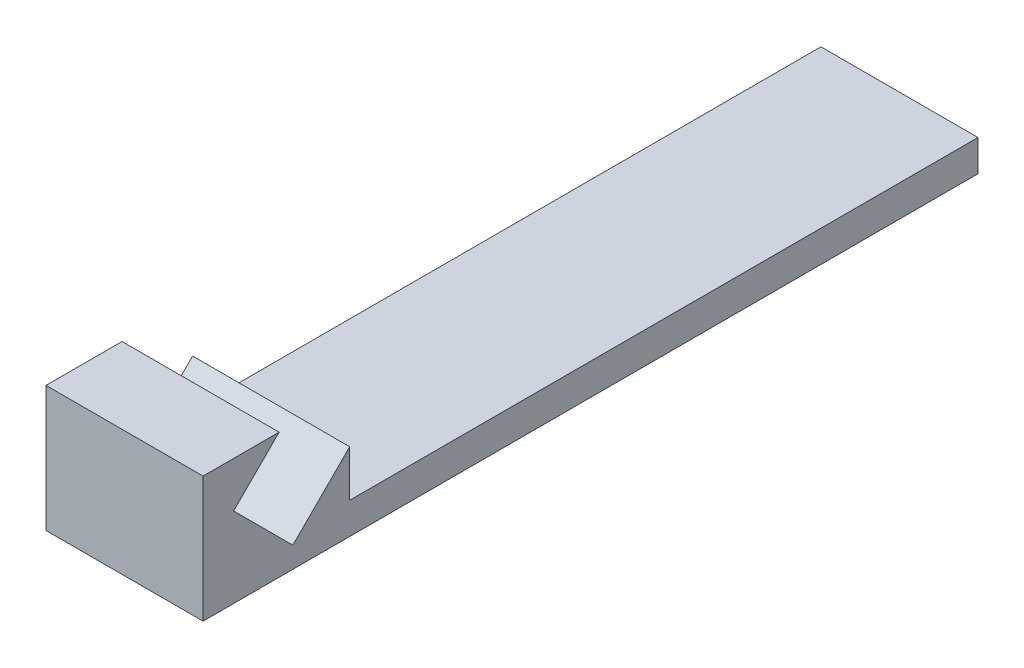
ISO-10303-21;
HEADER;
FILE_DESCRIPTION(('STEP AP214'),'2;1');
FILE_NAME('part.step','',(''),(''),'','','');
FILE_SCHEMA(('AUTOMOTIVE_DESIGN { 1 0 10303 214 1 1 1 1 }'));
ENDSEC;
DATA;
#1=APPLICATION_CONTEXT('core data for automotive mechanical design processes');
#2=APPLICATION_PROTOCOL_DEFINITION('international standard','automotive_design',2000,#1);
#3=PRODUCT_CONTEXT('',#1,'mechanical');
#4=PRODUCT('Part','Part','',(#3));
#5=PRODUCT_RELATED_PRODUCT_CATEGORY('part','',(#4));
#6=PRODUCT_DEFINITION_FORMATION('','',#4);
#7=PRODUCT_DEFINITION_CONTEXT('part definition',#1,'design');
#8=PRODUCT_DEFINITION('design','',#6,#7);
#9=PRODUCT_DEFINITION_SHAPE('','',#8);
#10=(LENGTH_UNIT() NAMED_UNIT(*) SI_UNIT(.MILLI.,.METRE.));
#11=(NAMED_UNIT(*) PLANE_ANGLE_UNIT() SI_UNIT($,.RADIAN.));
#12=(NAMED_UNIT(*) SI_UNIT($,.STERADIAN.) SOLID_ANGLE_UNIT());
#13=UNCERTAINTY_MEASURE_WITH_UNIT(LENGTH_MEASURE(1.E-05),#10,'distance_accuracy_value','');
#14=(GEOMETRIC_REPRESENTATION_CONTEXT(3) GLOBAL_UNCERTAINTY_ASSIGNED_CONTEXT((#13)) GLOBAL_UNIT_ASSIGNED_CONTEXT((#10,
#11,#12)) REPRESENTATION_CONTEXT('',''));
#15=CARTESIAN_POINT('',(0.,0.,0.));
#16=DIRECTION('',(0.,0.,1.));
#17=DIRECTION('',(1.,0.,0.));
#18=AXIS2_PLACEMENT_3D('',#15,#16,#17);
#19=CARTESIAN_POINT('',(-15.,0.,0.));
#20=DIRECTION('',(0.,0.,1.));
#21=DIRECTION('',(0.,-1.,0.));
#22=AXIS2_PLACEMENT_3D('',#19,#20,#21);
#23=PLANE('',#22);
#24=DIRECTION('',(1.,0.,0.));
#25=VECTOR('',#24,1.);
#26=CARTESIAN_POINT('',(-15.,4.42740381246919,0.));
#27=LINE('',#26,#25);
#28=CARTESIAN_POINT('',(-15.,4.42740381246919,0.));
#29=VERTEX_POINT('',#28);
#30=CARTESIAN_POINT('',(0.,4.42740381246919,0.));
#31=VERTEX_POINT('',#30);
#32=EDGE_CURVE('E141',#29,#31,#27,.T.);
#33=ORIENTED_EDGE('',*,*,#32,.T.);
#34=DIRECTION('',(0.,-1.,0.));
#35=VECTOR('',#34,1.);
#36=CARTESIAN_POINT('',(0.,0.,0.));
#37=LINE('',#36,#35);
#38=CARTESIAN_POINT('',(0.,0.,0.));
#39=VERTEX_POINT('',#38);
#40=EDGE_CURVE('E91',#31,#39,#37,.T.);
#41=ORIENTED_EDGE('',*,*,#40,.T.);
#42=DIRECTION('',(1.,0.,0.));
#43=VECTOR('',#42,1.);
#44=CARTESIAN_POINT('',(-15.,0.,0.));
#45=LINE('',#44,#43);
#46=CARTESIAN_POINT('',(-15.,0.,0.));
#47=VERTEX_POINT('',#46);
#48=EDGE_CURVE('E152',#47,#39,#45,.T.);
#49=ORIENTED_EDGE('',*,*,#48,.F.);
#50=DIRECTION('',(0.,-1.,0.));
#51=VECTOR('',#50,1.);
#52=CARTESIAN_POINT('',(-15.,0.,0.));
#53=LINE('',#52,#51);
#54=EDGE_CURVE('E66',#29,#47,#53,.T.);
#55=ORIENTED_EDGE('',*,*,#54,.F.);
#56=EDGE_LOOP('',(#33,#41,#49,#55));
#57=FACE_BOUND('',#56,.T.);
#58=ADVANCED_FACE('F43',(#57),#23,.F.);
#59=CARTESIAN_POINT('',(-15.,9.,0.));
#60=DIRECTION('',(0.,-1.,0.));
#61=DIRECTION('',(0.,0.,-1.));
#62=AXIS2_PLACEMENT_3D('',#59,#60,#61);
#63=PLANE('',#62);
#64=DIRECTION('',(1.,0.,0.));
#65=VECTOR('',#64,1.);
#66=CARTESIAN_POINT('',(-15.,9.,6.74111231145398));
#67=LINE('',#66,#65);
#68=CARTESIAN_POINT('',(-15.,9.,6.74111231145398));
#69=VERTEX_POINT('',#68);
#70=CARTESIAN_POINT('',(0.,9.,6.74111231145398));
#71=VERTEX_POINT('',#70);
#72=EDGE_CURVE('E57',#69,#71,#67,.T.);
#73=ORIENTED_EDGE('',*,*,#72,.F.);
#74=DIRECTION('',(0.,0.,-1.));
#75=VECTOR('',#74,1.);
#76=CARTESIAN_POINT('',(-15.,9.,0.));
#77=LINE('',#76,#75);
#78=CARTESIAN_POINT('',(-15.,9.,14.));
#79=VERTEX_POINT('',#78);
#80=EDGE_CURVE('E134',#79,#69,#77,.T.);
#81=ORIENTED_EDGE('',*,*,#80,.F.);
#82=DIRECTION('',(1.,0.,0.));
#83=VECTOR('',#82,1.);
#84=CARTESIAN_POINT('',(-15.,9.,14.));
#85=LINE('',#84,#83);
#86=CARTESIAN_POINT('',(0.,9.,14.));
#87=VERTEX_POINT('',#86);
#88=EDGE_CURVE('E99',#79,#87,#85,.T.);
#89=ORIENTED_EDGE('',*,*,#88,.T.);
#90=DIRECTION('',(0.,0.,-1.));
#91=VECTOR('',#90,1.);
#92=CARTESIAN_POINT('',(0.,9.,0.));
#93=LINE('',#92,#91);
#94=EDGE_CURVE('E140',#87,#71,#93,.T.);
#95=ORIENTED_EDGE('',*,*,#94,.T.);
#96=EDGE_LOOP('',(#73,#81,#89,#95));
#97=FACE_BOUND('',#96,.T.);
#98=ADVANCED_FACE('F195',(#97),#63,.F.);
#99=CARTESIAN_POINT('',(-15.,0.,0.));
#100=DIRECTION('',(1.,0.,0.));
#101=DIRECTION('',(0.,0.,-1.));
#102=AXIS2_PLACEMENT_3D('',#99,#100,#101);
#103=PLANE('',#102);
#104=DIRECTION('',(0.,-0.707106781186544,0.707106781186551));
#105=VECTOR('',#104,1.);
#106=CARTESIAN_POINT('',(-15.,2.21370190623463,2.2137019062346));
#107=LINE('',#106,#105);
#108=CARTESIAN_POINT('',(-15.,-0.999999999999535,5.42740381246879));
#109=VERTEX_POINT('',#108);
#110=EDGE_CURVE('E196',#29,#109,#107,.T.);
#111=ORIENTED_EDGE('',*,*,#110,.F.);
#112=ORIENTED_EDGE('',*,*,#54,.T.);
#113=DIRECTION('',(0.,0.,-1.));
#114=VECTOR('',#113,1.);
#115=CARTESIAN_POINT('',(-15.,0.,0.));
#116=LINE('',#115,#114);
#117=CARTESIAN_POINT('',(-15.,0.,-60.));
#118=VERTEX_POINT('',#117);
#119=EDGE_CURVE('E115',#47,#118,#116,.T.);
#120=ORIENTED_EDGE('',*,*,#119,.T.);
#121=DIRECTION('',(0.,-1.,0.));
#122=VECTOR('',#121,1.);
#123=CARTESIAN_POINT('',(-15.,0.,-60.));
#124=LINE('',#123,#122);
#125=CARTESIAN_POINT('',(-15.,-3.,-60.));
#126=VERTEX_POINT('',#125);
#127=EDGE_CURVE('E109',#118,#126,#124,.T.);
#128=ORIENTED_EDGE('',*,*,#127,.T.);
#129=DIRECTION('',(0.,0.,-1.));
#130=VECTOR('',#129,1.);
#131=CARTESIAN_POINT('',(-15.,-3.,0.));
#132=LINE('',#131,#130);
#133=CARTESIAN_POINT('',(-15.,-3.,14.));
#134=VERTEX_POINT('',#133);
#135=EDGE_CURVE('E114',#134,#126,#132,.T.);
#136=ORIENTED_EDGE('',*,*,#135,.F.);
#137=DIRECTION('',(0.,-1.,0.));
#138=VECTOR('',#137,1.);
#139=CARTESIAN_POINT('',(-15.,0.,14.));
#140=LINE('',#139,#138);
#141=EDGE_CURVE('E132',#79,#134,#140,.T.);
#142=ORIENTED_EDGE('',*,*,#141,.F.);
#143=ORIENTED_EDGE('',*,*,#80,.T.);
#144=DIRECTION('',(0.,0.707106781186544,-0.707106781186551));
#145=VECTOR('',#144,1.);
#146=CARTESIAN_POINT('',(-15.,7.87055615572704,7.87055615572696));
#147=LINE('',#146,#145);
#148=CARTESIAN_POINT('',(-15.,4.65685424949288,11.0842580619612));
#149=VERTEX_POINT('',#148);
#150=EDGE_CURVE('E189',#149,#69,#147,.T.);
#151=ORIENTED_EDGE('',*,*,#150,.F.);
#152=DIRECTION('',(0.,0.707106781186551,0.707106781186544));
#153=VECTOR('',#152,1.);
#154=CARTESIAN_POINT('',(-15.,-3.21370190623416,3.21370190623419));
#155=LINE('',#154,#153);
#156=EDGE_CURVE('E192',#109,#149,#155,.T.);
#157=ORIENTED_EDGE('',*,*,#156,.F.);
#158=EDGE_LOOP('',(#111,#112,#120,#128,#136,#142,#143,#151,#157));
#159=FACE_BOUND('',#158,.T.);
#160=ADVANCED_FACE('F111',(#159),#103,.F.);
#161=CARTESIAN_POINT('',(0.,0.,0.));
#162=DIRECTION('',(1.,0.,0.));
#163=DIRECTION('',(0.,0.,-1.));
#164=AXIS2_PLACEMENT_3D('',#161,#162,#163);
#165=PLANE('',#164);
#166=ORIENTED_EDGE('',*,*,#40,.F.);
#167=DIRECTION('',(0.,-0.707106781186544,0.707106781186551));
#168=VECTOR('',#167,1.);
#169=CARTESIAN_POINT('',(0.,43.1941738241594,-38.7667700116907));
#170=LINE('',#169,#168);
#171=CARTESIAN_POINT('',(0.,-0.999999999999535,5.42740381246879));
#172=VERTEX_POINT('',#171);
#173=EDGE_CURVE('E11',#31,#172,#170,.T.);
#174=ORIENTED_EDGE('',*,*,#173,.T.);
#175=DIRECTION('',(0.,0.707106781186551,0.707106781186544));
#176=VECTOR('',#175,1.);
#177=CARTESIAN_POINT('',(0.,-0.999999999999536,5.42740381246879));
#178=LINE('',#177,#176);
#179=CARTESIAN_POINT('',(0.,4.65685424949288,11.0842580619612));
#180=VERTEX_POINT('',#179);
#181=EDGE_CURVE('E50',#172,#180,#178,.T.);
#182=ORIENTED_EDGE('',*,*,#181,.T.);
#183=DIRECTION('',(0.,-0.707106781186544,0.707106781186551));
#184=VECTOR('',#183,1.);
#185=CARTESIAN_POINT('',(0.,48.8510280736519,-33.1099157621983));
#186=LINE('',#185,#184);
#187=EDGE_CURVE('E155',#71,#180,#186,.T.);
#188=ORIENTED_EDGE('',*,*,#187,.F.);
#189=ORIENTED_EDGE('',*,*,#94,.F.);
#190=DIRECTION('',(0.,-1.,0.));
#191=VECTOR('',#190,1.);
#192=CARTESIAN_POINT('',(0.,0.,14.));
#193=LINE('',#192,#191);
#194=CARTESIAN_POINT('',(0.,-3.,14.));
#195=VERTEX_POINT('',#194);
#196=EDGE_CURVE('E144',#87,#195,#193,.T.);
#197=ORIENTED_EDGE('',*,*,#196,.T.);
#198=DIRECTION('',(0.,0.,-1.));
#199=VECTOR('',#198,1.);
#200=CARTESIAN_POINT('',(0.,-3.,0.));
#201=LINE('',#200,#199);
#202=CARTESIAN_POINT('',(0.,-3.,-60.));
#203=VERTEX_POINT('',#202);
#204=EDGE_CURVE('E147',#195,#203,#201,.T.);
#205=ORIENTED_EDGE('',*,*,#204,.T.);
#206=DIRECTION('',(0.,-1.,0.));
#207=VECTOR('',#206,1.);
#208=CARTESIAN_POINT('',(0.,0.,-60.));
#209=LINE('',#208,#207);
#210=CARTESIAN_POINT('',(0.,0.,-60.));
#211=VERTEX_POINT('',#210);
#212=EDGE_CURVE('E124',#211,#203,#209,.T.);
#213=ORIENTED_EDGE('',*,*,#212,.F.);
#214=DIRECTION('',(0.,0.,-1.));
#215=VECTOR('',#214,1.);
#216=CARTESIAN_POINT('',(0.,0.,0.));
#217=LINE('',#216,#215);
#218=EDGE_CURVE('E150',#39,#211,#217,.T.);
#219=ORIENTED_EDGE('',*,*,#218,.F.);
#220=EDGE_LOOP('',(#166,#174,#182,#188,#189,#197,#205,#213,#219));
#221=FACE_BOUND('',#220,.T.);
#222=ADVANCED_FACE('F163',(#221),#165,.T.);
#223=CARTESIAN_POINT('',(-15.,0.,0.));
#224=DIRECTION('',(0.,-1.,0.));
#225=DIRECTION('',(0.,0.,-1.));
#226=AXIS2_PLACEMENT_3D('',#223,#224,#225);
#227=PLANE('',#226);
#228=ORIENTED_EDGE('',*,*,#218,.T.);
#229=DIRECTION('',(1.,0.,0.));
#230=VECTOR('',#229,1.);
#231=CARTESIAN_POINT('',(-15.,0.,-60.));
#232=LINE('',#231,#230);
#233=EDGE_CURVE('E128',#118,#211,#232,.T.);
#234=ORIENTED_EDGE('',*,*,#233,.F.);
#235=ORIENTED_EDGE('',*,*,#119,.F.);
#236=ORIENTED_EDGE('',*,*,#48,.T.);
#237=EDGE_LOOP('',(#228,#234,#235,#236));
#238=FACE_BOUND('',#237,.T.);
#239=ADVANCED_FACE('F205',(#238),#227,.F.);
#240=CARTESIAN_POINT('',(-15.,0.,-60.));
#241=DIRECTION('',(0.,0.,1.));
#242=DIRECTION('',(1.,0.,0.));
#243=AXIS2_PLACEMENT_3D('',#240,#241,#242);
#244=PLANE('',#243);
#245=ORIENTED_EDGE('',*,*,#212,.T.);
#246=DIRECTION('',(1.,0.,0.));
#247=VECTOR('',#246,1.);
#248=CARTESIAN_POINT('',(-15.,-3.,-60.));
#249=LINE('',#248,#247);
#250=EDGE_CURVE('E121',#126,#203,#249,.T.);
#251=ORIENTED_EDGE('',*,*,#250,.F.);
#252=ORIENTED_EDGE('',*,*,#127,.F.);
#253=ORIENTED_EDGE('',*,*,#233,.T.);
#254=EDGE_LOOP('',(#245,#251,#252,#253));
#255=FACE_BOUND('',#254,.T.);
#256=ADVANCED_FACE('F122',(#255),#244,.F.);
#257=CARTESIAN_POINT('',(-15.,-3.,0.));
#258=DIRECTION('',(0.,-1.,0.));
#259=DIRECTION('',(0.,0.,-1.));
#260=AXIS2_PLACEMENT_3D('',#257,#258,#259);
#261=PLANE('',#260);
#262=ORIENTED_EDGE('',*,*,#204,.F.);
#263=DIRECTION('',(1.,0.,0.));
#264=VECTOR('',#263,1.);
#265=CARTESIAN_POINT('',(-15.,-3.,14.));
#266=LINE('',#265,#264);
#267=EDGE_CURVE('E129',#134,#195,#266,.T.);
#268=ORIENTED_EDGE('',*,*,#267,.F.);
#269=ORIENTED_EDGE('',*,*,#135,.T.);
#270=ORIENTED_EDGE('',*,*,#250,.T.);
#271=EDGE_LOOP('',(#262,#268,#269,#270));
#272=FACE_BOUND('',#271,.T.);
#273=ADVANCED_FACE('F131',(#272),#261,.T.);
#274=CARTESIAN_POINT('',(-15.,0.,14.));
#275=DIRECTION('',(0.,0.,1.));
#276=DIRECTION('',(0.,-1.,0.));
#277=AXIS2_PLACEMENT_3D('',#274,#275,#276);
#278=PLANE('',#277);
#279=ORIENTED_EDGE('',*,*,#196,.F.);
#280=ORIENTED_EDGE('',*,*,#88,.F.);
#281=ORIENTED_EDGE('',*,*,#141,.T.);
#282=ORIENTED_EDGE('',*,*,#267,.T.);
#283=EDGE_LOOP('',(#279,#280,#281,#282));
#284=FACE_BOUND('',#283,.T.);
#285=ADVANCED_FACE('F206',(#284),#278,.T.);
#286=CARTESIAN_POINT('',(-15.,2.21370190623463,2.2137019062346));
#287=DIRECTION('',(0.,0.707106781186551,0.707106781186544));
#288=DIRECTION('',(0.,-0.707106781186544,0.707106781186551));
#289=AXIS2_PLACEMENT_3D('',#286,#287,#288);
#290=PLANE('',#289);
#291=ORIENTED_EDGE('',*,*,#173,.F.);
#292=ORIENTED_EDGE('',*,*,#32,.F.);
#293=ORIENTED_EDGE('',*,*,#110,.T.);
#294=DIRECTION('',(1.,0.,0.));
#295=VECTOR('',#294,1.);
#296=CARTESIAN_POINT('',(-15.,-0.999999999999535,5.42740381246879));
#297=LINE('',#296,#295);
#298=EDGE_CURVE('E175',#109,#172,#297,.T.);
#299=ORIENTED_EDGE('',*,*,#298,.T.);
#300=EDGE_LOOP('',(#291,#292,#293,#299));
#301=FACE_BOUND('',#300,.T.);
#302=ADVANCED_FACE('F208',(#301),#290,.T.);
#303=CARTESIAN_POINT('',(-15.,-3.21370190623416,3.21370190623419));
#304=DIRECTION('',(0.,0.707106781186544,-0.707106781186551));
#305=DIRECTION('',(0.,0.707106781186551,0.707106781186544));
#306=AXIS2_PLACEMENT_3D('',#303,#304,#305);
#307=PLANE('',#306);
#308=ORIENTED_EDGE('',*,*,#181,.F.);
#309=ORIENTED_EDGE('',*,*,#298,.F.);
#310=ORIENTED_EDGE('',*,*,#156,.T.);
#311=DIRECTION('',(1.,0.,0.));
#312=VECTOR('',#311,1.);
#313=CARTESIAN_POINT('',(-15.,4.65685424949288,11.0842580619612));
#314=LINE('',#313,#312);
#315=EDGE_CURVE('E178',#149,#180,#314,.T.);
#316=ORIENTED_EDGE('',*,*,#315,.T.);
#317=EDGE_LOOP('',(#308,#309,#310,#316));
#318=FACE_BOUND('',#317,.T.);
#319=ADVANCED_FACE('F171',(#318),#307,.T.);
#320=CARTESIAN_POINT('',(-15.,7.87055615572704,7.87055615572696));
#321=DIRECTION('',(0.,-0.707106781186551,-0.707106781186544));
#322=DIRECTION('',(0.,0.707106781186544,-0.707106781186551));
#323=AXIS2_PLACEMENT_3D('',#320,#321,#322);
#324=PLANE('',#323);
#325=ORIENTED_EDGE('',*,*,#187,.T.);
#326=ORIENTED_EDGE('',*,*,#315,.F.);
#327=ORIENTED_EDGE('',*,*,#150,.T.);
#328=ORIENTED_EDGE('',*,*,#72,.T.);
#329=EDGE_LOOP('',(#325,#326,#327,#328));
#330=FACE_BOUND('',#329,.T.);
#331=ADVANCED_FACE('F190',(#330),#324,.T.);
#332=CLOSED_SHELL('',(#58,#98,#160,#222,#239,#256,#273,#285,#302,#319,#331));
#333=MANIFOLD_SOLID_BREP('B2',#332);
#334=ADVANCED_BREP_SHAPE_REPRESENTATION('',(#18,#333),#14);
#335=SHAPE_DEFINITION_REPRESENTATION(#9,#334);
ENDSEC;
END-ISO-10303-21;
